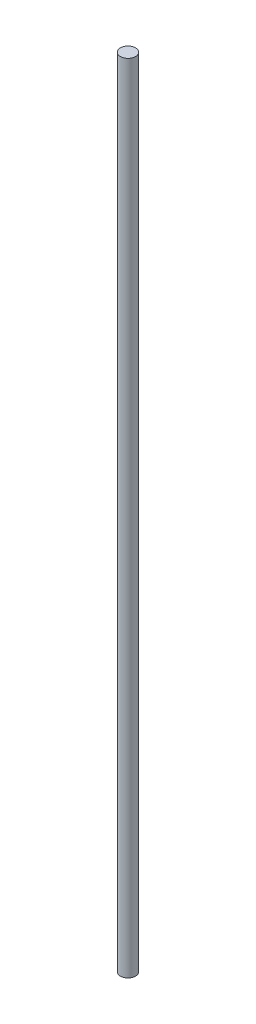
ISO-10303-21;
HEADER;
FILE_DESCRIPTION(('STEP AP214'),'2;1');
FILE_NAME('part.step','',(''),(''),'','','');
FILE_SCHEMA(('AUTOMOTIVE_DESIGN { 1 0 10303 214 1 1 1 1 }'));
ENDSEC;
DATA;
#1=APPLICATION_CONTEXT('core data for automotive mechanical design processes');
#2=APPLICATION_PROTOCOL_DEFINITION('international standard','automotive_design',2000,#1);
#3=PRODUCT_CONTEXT('',#1,'mechanical');
#4=PRODUCT('Part','Part','',(#3));
#5=PRODUCT_RELATED_PRODUCT_CATEGORY('part','',(#4));
#6=PRODUCT_DEFINITION_FORMATION('','',#4);
#7=PRODUCT_DEFINITION_CONTEXT('part definition',#1,'design');
#8=PRODUCT_DEFINITION('design','',#6,#7);
#9=PRODUCT_DEFINITION_SHAPE('','',#8);
#10=(LENGTH_UNIT() NAMED_UNIT(*) SI_UNIT(.MILLI.,.METRE.));
#11=(NAMED_UNIT(*) PLANE_ANGLE_UNIT() SI_UNIT($,.RADIAN.));
#12=(NAMED_UNIT(*) SI_UNIT($,.STERADIAN.) SOLID_ANGLE_UNIT());
#13=UNCERTAINTY_MEASURE_WITH_UNIT(LENGTH_MEASURE(1.E-05),#10,'distance_accuracy_value','');
#14=(GEOMETRIC_REPRESENTATION_CONTEXT(3) GLOBAL_UNCERTAINTY_ASSIGNED_CONTEXT((#13)) GLOBAL_UNIT_ASSIGNED_CONTEXT((#10,
#11,#12)) REPRESENTATION_CONTEXT('',''));
#15=CARTESIAN_POINT('',(0.,0.,0.));
#16=DIRECTION('',(0.,0.,1.));
#17=DIRECTION('',(1.,0.,0.));
#18=AXIS2_PLACEMENT_3D('',#15,#16,#17);
#19=CARTESIAN_POINT('',(-20.4401229268001,210.,-20.5760250900653));
#20=DIRECTION('',(0.,-1.,0.));
#21=DIRECTION('',(0.,0.,-1.));
#22=AXIS2_PLACEMENT_3D('',#19,#20,#21);
#23=CYLINDRICAL_SURFACE('',#22,2.);
#24=CARTESIAN_POINT('',(-20.4401229268001,210.,-20.5760250900653));
#25=DIRECTION('',(0.,1.,0.));
#26=DIRECTION('',(0.,0.,1.));
#27=AXIS2_PLACEMENT_3D('',#24,#25,#26);
#28=CIRCLE('',#27,2.);
#29=CARTESIAN_POINT('',(-20.4401229268001,210.,-18.5760250900653));
#30=VERTEX_POINT('',#29);
#31=EDGE_CURVE('E10',#30,#30,#28,.T.);
#32=ORIENTED_EDGE('',*,*,#31,.F.);
#33=EDGE_LOOP('',(#32));
#34=FACE_BOUND('',#33,.T.);
#35=CARTESIAN_POINT('',(-20.4401229268001,0.,-20.5760250900653));
#36=DIRECTION('',(0.,1.,0.));
#37=DIRECTION('',(0.,0.,1.));
#38=AXIS2_PLACEMENT_3D('',#35,#36,#37);
#39=CIRCLE('',#38,2.);
#40=CARTESIAN_POINT('',(-20.4401229268001,0.,-18.5760250900653));
#41=VERTEX_POINT('',#40);
#42=EDGE_CURVE('E37',#41,#41,#39,.T.);
#43=ORIENTED_EDGE('',*,*,#42,.T.);
#44=EDGE_LOOP('',(#43));
#45=FACE_BOUND('',#44,.T.);
#46=ADVANCED_FACE('F34',(#34,#45),#23,.T.);
#47=CARTESIAN_POINT('',(-20.4401229268001,210.,-20.5760250900653));
#48=DIRECTION('',(0.,1.,0.));
#49=DIRECTION('',(0.,0.,1.));
#50=AXIS2_PLACEMENT_3D('',#47,#48,#49);
#51=PLANE('',#50);
#52=ORIENTED_EDGE('',*,*,#31,.T.);
#53=EDGE_LOOP('',(#52));
#54=FACE_BOUND('',#53,.T.);
#55=ADVANCED_FACE('F49',(#54),#51,.T.);
#56=CARTESIAN_POINT('',(-20.4401229268001,0.,-20.5760250900653));
#57=DIRECTION('',(0.,1.,0.));
#58=DIRECTION('',(0.,0.,1.));
#59=AXIS2_PLACEMENT_3D('',#56,#57,#58);
#60=PLANE('',#59);
#61=ORIENTED_EDGE('',*,*,#42,.F.);
#62=EDGE_LOOP('',(#61));
#63=FACE_BOUND('',#62,.T.);
#64=ADVANCED_FACE('F47',(#63),#60,.F.);
#65=CLOSED_SHELL('',(#46,#55,#64));
#66=MANIFOLD_SOLID_BREP('B2',#65);
#67=ADVANCED_BREP_SHAPE_REPRESENTATION('',(#18,#66),#14);
#68=SHAPE_DEFINITION_REPRESENTATION(#9,#67);
ENDSEC;
END-ISO-10303-21;
